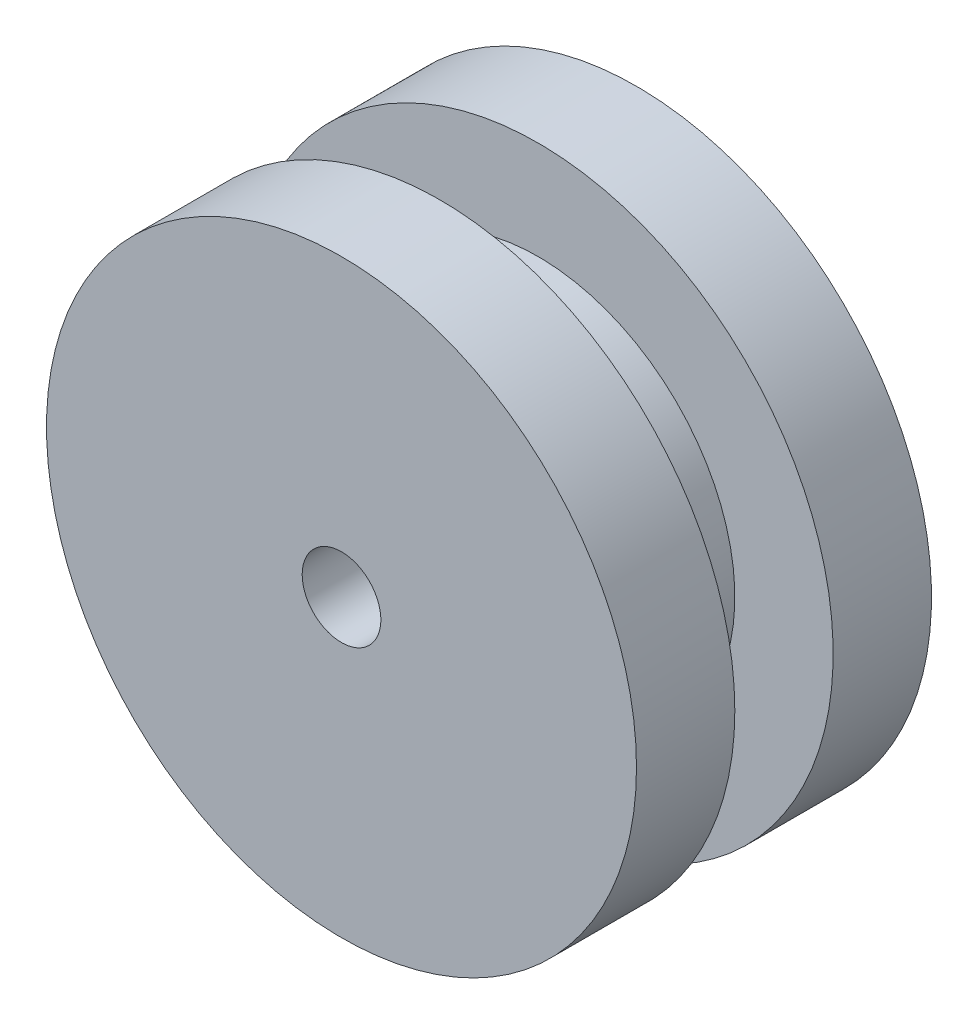
ISO-10303-21;
HEADER;
FILE_DESCRIPTION(('STEP AP214'),'2;1');
FILE_NAME('part.step','',(''),(''),'','','');
FILE_SCHEMA(('AUTOMOTIVE_DESIGN { 1 0 10303 214 1 1 1 1 }'));
ENDSEC;
DATA;
#1=APPLICATION_CONTEXT('core data for automotive mechanical design processes');
#2=APPLICATION_PROTOCOL_DEFINITION('international standard','automotive_design',2000,#1);
#3=PRODUCT_CONTEXT('',#1,'mechanical');
#4=PRODUCT('Part','Part','',(#3));
#5=PRODUCT_RELATED_PRODUCT_CATEGORY('part','',(#4));
#6=PRODUCT_DEFINITION_FORMATION('','',#4);
#7=PRODUCT_DEFINITION_CONTEXT('part definition',#1,'design');
#8=PRODUCT_DEFINITION('design','',#6,#7);
#9=PRODUCT_DEFINITION_SHAPE('','',#8);
#10=(LENGTH_UNIT() NAMED_UNIT(*) SI_UNIT(.MILLI.,.METRE.));
#11=(NAMED_UNIT(*) PLANE_ANGLE_UNIT() SI_UNIT($,.RADIAN.));
#12=(NAMED_UNIT(*) SI_UNIT($,.STERADIAN.) SOLID_ANGLE_UNIT());
#13=UNCERTAINTY_MEASURE_WITH_UNIT(LENGTH_MEASURE(1.E-05),#10,'distance_accuracy_value','');
#14=(GEOMETRIC_REPRESENTATION_CONTEXT(3) GLOBAL_UNCERTAINTY_ASSIGNED_CONTEXT((#13)) GLOBAL_UNIT_ASSIGNED_CONTEXT((#10,
#11,#12)) REPRESENTATION_CONTEXT('',''));
#15=CARTESIAN_POINT('',(0.,0.,0.));
#16=DIRECTION('',(0.,0.,1.));
#17=DIRECTION('',(1.,0.,0.));
#18=AXIS2_PLACEMENT_3D('',#15,#16,#17);
#19=CARTESIAN_POINT('',(0.,0.,5.));
#20=DIRECTION('',(0.,0.,-1.));
#21=DIRECTION('',(-1.,0.,0.));
#22=AXIS2_PLACEMENT_3D('',#19,#20,#21);
#23=CYLINDRICAL_SURFACE('',#22,20.);
#24=CARTESIAN_POINT('',(0.,0.,5.));
#25=DIRECTION('',(0.,0.,1.));
#26=DIRECTION('',(1.,0.,0.));
#27=AXIS2_PLACEMENT_3D('',#24,#25,#26);
#28=CIRCLE('',#27,20.);
#29=CARTESIAN_POINT('',(20.,0.,5.));
#30=VERTEX_POINT('',#29);
#31=EDGE_CURVE('E10',#30,#30,#28,.T.);
#32=ORIENTED_EDGE('',*,*,#31,.F.);
#33=EDGE_LOOP('',(#32));
#34=FACE_BOUND('',#33,.T.);
#35=CARTESIAN_POINT('',(0.,0.,-5.));
#36=DIRECTION('',(0.,0.,-1.));
#37=DIRECTION('',(-1.,0.,0.));
#38=AXIS2_PLACEMENT_3D('',#35,#36,#37);
#39=CIRCLE('',#38,20.);
#40=CARTESIAN_POINT('',(-20.,0.,-5.));
#41=VERTEX_POINT('',#40);
#42=EDGE_CURVE('E46',#41,#41,#39,.T.);
#43=ORIENTED_EDGE('',*,*,#42,.F.);
#44=EDGE_LOOP('',(#43));
#45=FACE_BOUND('',#44,.T.);
#46=ADVANCED_FACE('F31',(#34,#45),#23,.T.);
#47=CARTESIAN_POINT('',(0.,0.,5.));
#48=DIRECTION('',(0.,0.,1.));
#49=DIRECTION('',(1.,0.,0.));
#50=AXIS2_PLACEMENT_3D('',#47,#48,#49);
#51=PLANE('',#50);
#52=CARTESIAN_POINT('',(0.,0.,5.));
#53=DIRECTION('',(0.,0.,1.));
#54=DIRECTION('',(1.,0.,0.));
#55=AXIS2_PLACEMENT_3D('',#52,#53,#54);
#56=CIRCLE('',#55,30.);
#57=CARTESIAN_POINT('',(30.,0.,5.));
#58=VERTEX_POINT('',#57);
#59=EDGE_CURVE('E41',#58,#58,#56,.T.);
#60=ORIENTED_EDGE('',*,*,#59,.F.);
#61=EDGE_LOOP('',(#60));
#62=FACE_BOUND('',#61,.T.);
#63=ORIENTED_EDGE('',*,*,#31,.T.);
#64=EDGE_LOOP('',(#63));
#65=FACE_BOUND('',#64,.T.);
#66=ADVANCED_FACE('F90',(#62,#65),#51,.F.);
#67=CARTESIAN_POINT('',(0.,0.,15.));
#68=DIRECTION('',(0.,0.,-1.));
#69=DIRECTION('',(-1.,0.,0.));
#70=AXIS2_PLACEMENT_3D('',#67,#68,#69);
#71=CYLINDRICAL_SURFACE('',#70,30.);
#72=CARTESIAN_POINT('',(0.,0.,15.));
#73=DIRECTION('',(0.,0.,1.));
#74=DIRECTION('',(1.,0.,0.));
#75=AXIS2_PLACEMENT_3D('',#72,#73,#74);
#76=CIRCLE('',#75,30.);
#77=CARTESIAN_POINT('',(30.,0.,15.));
#78=VERTEX_POINT('',#77);
#79=EDGE_CURVE('E37',#78,#78,#76,.T.);
#80=ORIENTED_EDGE('',*,*,#79,.F.);
#81=EDGE_LOOP('',(#80));
#82=FACE_BOUND('',#81,.T.);
#83=ORIENTED_EDGE('',*,*,#59,.T.);
#84=EDGE_LOOP('',(#83));
#85=FACE_BOUND('',#84,.T.);
#86=ADVANCED_FACE('F95',(#82,#85),#71,.T.);
#87=CARTESIAN_POINT('',(0.,0.,15.));
#88=DIRECTION('',(0.,0.,1.));
#89=DIRECTION('',(1.,0.,0.));
#90=AXIS2_PLACEMENT_3D('',#87,#88,#89);
#91=PLANE('',#90);
#92=CARTESIAN_POINT('',(0.,0.,15.));
#93=DIRECTION('',(0.,0.,-1.));
#94=DIRECTION('',(-1.,0.,0.));
#95=AXIS2_PLACEMENT_3D('',#92,#93,#94);
#96=CIRCLE('',#95,4.);
#97=CARTESIAN_POINT('',(-4.,0.,15.));
#98=VERTEX_POINT('',#97);
#99=EDGE_CURVE('E54',#98,#98,#96,.T.);
#100=ORIENTED_EDGE('',*,*,#99,.T.);
#101=EDGE_LOOP('',(#100));
#102=FACE_BOUND('',#101,.T.);
#103=ORIENTED_EDGE('',*,*,#79,.T.);
#104=EDGE_LOOP('',(#103));
#105=FACE_BOUND('',#104,.T.);
#106=ADVANCED_FACE('F63',(#102,#105),#91,.T.);
#107=CARTESIAN_POINT('',(0.,0.,-5.));
#108=DIRECTION('',(0.,0.,-1.));
#109=DIRECTION('',(-1.,0.,0.));
#110=AXIS2_PLACEMENT_3D('',#107,#108,#109);
#111=PLANE('',#110);
#112=CARTESIAN_POINT('',(0.,0.,-5.));
#113=DIRECTION('',(0.,0.,-1.));
#114=DIRECTION('',(-1.,0.,0.));
#115=AXIS2_PLACEMENT_3D('',#112,#113,#114);
#116=CIRCLE('',#115,30.);
#117=CARTESIAN_POINT('',(-30.,0.,-5.));
#118=VERTEX_POINT('',#117);
#119=EDGE_CURVE('E51',#118,#118,#116,.T.);
#120=ORIENTED_EDGE('',*,*,#119,.F.);
#121=EDGE_LOOP('',(#120));
#122=FACE_BOUND('',#121,.T.);
#123=ORIENTED_EDGE('',*,*,#42,.T.);
#124=EDGE_LOOP('',(#123));
#125=FACE_BOUND('',#124,.T.);
#126=ADVANCED_FACE('F80',(#122,#125),#111,.F.);
#127=CARTESIAN_POINT('',(0.,0.,-15.));
#128=DIRECTION('',(0.,0.,1.));
#129=DIRECTION('',(1.,0.,0.));
#130=AXIS2_PLACEMENT_3D('',#127,#128,#129);
#131=CYLINDRICAL_SURFACE('',#130,30.);
#132=CARTESIAN_POINT('',(0.,0.,-15.));
#133=DIRECTION('',(0.,0.,-1.));
#134=DIRECTION('',(-1.,0.,0.));
#135=AXIS2_PLACEMENT_3D('',#132,#133,#134);
#136=CIRCLE('',#135,30.);
#137=CARTESIAN_POINT('',(-30.,0.,-15.));
#138=VERTEX_POINT('',#137);
#139=EDGE_CURVE('E50',#138,#138,#136,.T.);
#140=ORIENTED_EDGE('',*,*,#139,.F.);
#141=EDGE_LOOP('',(#140));
#142=FACE_BOUND('',#141,.T.);
#143=ORIENTED_EDGE('',*,*,#119,.T.);
#144=EDGE_LOOP('',(#143));
#145=FACE_BOUND('',#144,.T.);
#146=ADVANCED_FACE('F74',(#142,#145),#131,.T.);
#147=CARTESIAN_POINT('',(0.,0.,-15.));
#148=DIRECTION('',(0.,0.,-1.));
#149=DIRECTION('',(-1.,0.,0.));
#150=AXIS2_PLACEMENT_3D('',#147,#148,#149);
#151=PLANE('',#150);
#152=CARTESIAN_POINT('',(0.,0.,-15.));
#153=DIRECTION('',(0.,0.,-1.));
#154=DIRECTION('',(-1.,0.,0.));
#155=AXIS2_PLACEMENT_3D('',#152,#153,#154);
#156=CIRCLE('',#155,4.);
#157=CARTESIAN_POINT('',(-4.,0.,-15.));
#158=VERTEX_POINT('',#157);
#159=EDGE_CURVE('E57',#158,#158,#156,.T.);
#160=ORIENTED_EDGE('',*,*,#159,.F.);
#161=EDGE_LOOP('',(#160));
#162=FACE_BOUND('',#161,.T.);
#163=ORIENTED_EDGE('',*,*,#139,.T.);
#164=EDGE_LOOP('',(#163));
#165=FACE_BOUND('',#164,.T.);
#166=ADVANCED_FACE('F68',(#162,#165),#151,.T.);
#167=CARTESIAN_POINT('',(0.,0.,15.));
#168=DIRECTION('',(0.,0.,-1.));
#169=DIRECTION('',(-1.,0.,0.));
#170=AXIS2_PLACEMENT_3D('',#167,#168,#169);
#171=CYLINDRICAL_SURFACE('',#170,4.);
#172=ORIENTED_EDGE('',*,*,#99,.F.);
#173=EDGE_LOOP('',(#172));
#174=FACE_BOUND('',#173,.T.);
#175=ORIENTED_EDGE('',*,*,#159,.T.);
#176=EDGE_LOOP('',(#175));
#177=FACE_BOUND('',#176,.T.);
#178=ADVANCED_FACE('F65',(#174,#177),#171,.F.);
#179=CLOSED_SHELL('',(#46,#66,#86,#106,#126,#146,#166,#178));
#180=MANIFOLD_SOLID_BREP('B2',#179);
#181=ADVANCED_BREP_SHAPE_REPRESENTATION('',(#18,#180),#14);
#182=SHAPE_DEFINITION_REPRESENTATION(#9,#181);
ENDSEC;
END-ISO-10303-21;
